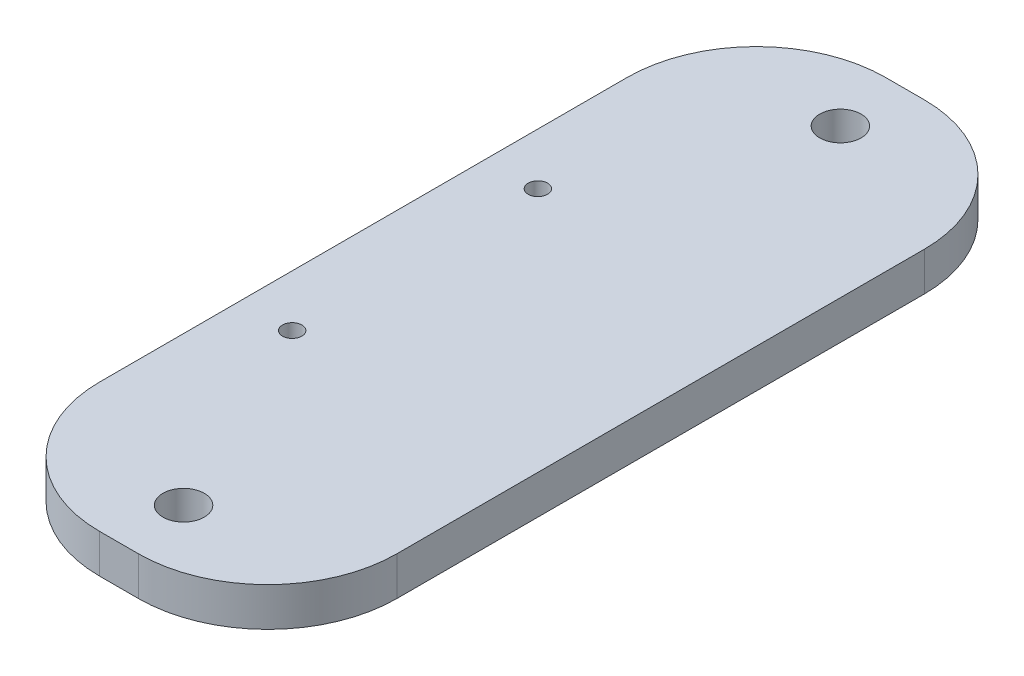
ISO-10303-21;
HEADER;
FILE_DESCRIPTION(('STEP AP214'),'2;1');
FILE_NAME('part.step','',(''),(''),'','','');
FILE_SCHEMA(('AUTOMOTIVE_DESIGN { 1 0 10303 214 1 1 1 1 }'));
ENDSEC;
DATA;
#1=APPLICATION_CONTEXT('core data for automotive mechanical design processes');
#2=APPLICATION_PROTOCOL_DEFINITION('international standard','automotive_design',2000,#1);
#3=PRODUCT_CONTEXT('',#1,'mechanical');
#4=PRODUCT('Part','Part','',(#3));
#5=PRODUCT_RELATED_PRODUCT_CATEGORY('part','',(#4));
#6=PRODUCT_DEFINITION_FORMATION('','',#4);
#7=PRODUCT_DEFINITION_CONTEXT('part definition',#1,'design');
#8=PRODUCT_DEFINITION('design','',#6,#7);
#9=PRODUCT_DEFINITION_SHAPE('','',#8);
#10=(LENGTH_UNIT() NAMED_UNIT(*) SI_UNIT(.MILLI.,.METRE.));
#11=(NAMED_UNIT(*) PLANE_ANGLE_UNIT() SI_UNIT($,.RADIAN.));
#12=(NAMED_UNIT(*) SI_UNIT($,.STERADIAN.) SOLID_ANGLE_UNIT());
#13=UNCERTAINTY_MEASURE_WITH_UNIT(LENGTH_MEASURE(1.E-05),#10,'distance_accuracy_value','');
#14=(GEOMETRIC_REPRESENTATION_CONTEXT(3) GLOBAL_UNCERTAINTY_ASSIGNED_CONTEXT((#13)) GLOBAL_UNIT_ASSIGNED_CONTEXT((#10,
#11,#12)) REPRESENTATION_CONTEXT('',''));
#15=CARTESIAN_POINT('',(0.,0.,0.));
#16=DIRECTION('',(0.,0.,1.));
#17=DIRECTION('',(1.,0.,0.));
#18=AXIS2_PLACEMENT_3D('',#15,#16,#17);
#19=CARTESIAN_POINT('',(0.,3.,0.));
#20=DIRECTION('',(0.,1.,0.));
#21=DIRECTION('',(0.,0.,1.));
#22=AXIS2_PLACEMENT_3D('',#19,#20,#21);
#23=PLANE('',#22);
#24=CARTESIAN_POINT('',(0.,3.,-25.4));
#25=DIRECTION('',(0.,1.,0.));
#26=DIRECTION('',(0.,0.,1.));
#27=AXIS2_PLACEMENT_3D('',#24,#25,#26);
#28=CIRCLE('',#27,1.6);
#29=CARTESIAN_POINT('',(0.,3.,-23.8));
#30=VERTEX_POINT('',#29);
#31=EDGE_CURVE('E200',#30,#30,#28,.T.);
#32=ORIENTED_EDGE('',*,*,#31,.F.);
#33=EDGE_LOOP('',(#32));
#34=FACE_BOUND('',#33,.T.);
#35=CARTESIAN_POINT('',(-7.5,3.,-9.5));
#36=DIRECTION('',(0.,1.,0.));
#37=DIRECTION('',(0.,0.,1.));
#38=AXIS2_PLACEMENT_3D('',#35,#36,#37);
#39=CIRCLE('',#38,0.750000000000002);
#40=CARTESIAN_POINT('',(-7.5,3.,-8.75));
#41=VERTEX_POINT('',#40);
#42=EDGE_CURVE('E137',#41,#41,#39,.T.);
#43=ORIENTED_EDGE('',*,*,#42,.F.);
#44=EDGE_LOOP('',(#43));
#45=FACE_BOUND('',#44,.T.);
#46=DIRECTION('',(1.,0.,0.));
#47=VECTOR('',#46,1.);
#48=CARTESIAN_POINT('',(-11.5,3.,30.4));
#49=LINE('',#48,#47);
#50=CARTESIAN_POINT('',(-1.5,3.,30.4));
#51=VERTEX_POINT('',#50);
#52=CARTESIAN_POINT('',(1.50000000000001,3.,30.4));
#53=VERTEX_POINT('',#52);
#54=EDGE_CURVE('E147',#51,#53,#49,.T.);
#55=ORIENTED_EDGE('',*,*,#54,.T.);
#56=CARTESIAN_POINT('',(1.50000000000001,3.,20.4));
#57=DIRECTION('',(0.,1.,0.));
#58=DIRECTION('',(0.,0.,1.));
#59=AXIS2_PLACEMENT_3D('',#56,#57,#58);
#60=CIRCLE('',#59,10.);
#61=CARTESIAN_POINT('',(11.5,3.,20.4));
#62=VERTEX_POINT('',#61);
#63=EDGE_CURVE('E167',#53,#62,#60,.T.);
#64=ORIENTED_EDGE('',*,*,#63,.T.);
#65=DIRECTION('',(0.,0.,-1.));
#66=VECTOR('',#65,1.);
#67=CARTESIAN_POINT('',(11.5,3.,-30.4));
#68=LINE('',#67,#66);
#69=CARTESIAN_POINT('',(11.5,3.,-20.4));
#70=VERTEX_POINT('',#69);
#71=EDGE_CURVE('E129',#62,#70,#68,.T.);
#72=ORIENTED_EDGE('',*,*,#71,.T.);
#73=CARTESIAN_POINT('',(1.5,3.,-20.4));
#74=DIRECTION('',(0.,1.,0.));
#75=DIRECTION('',(0.,0.,1.));
#76=AXIS2_PLACEMENT_3D('',#73,#74,#75);
#77=CIRCLE('',#76,10.);
#78=CARTESIAN_POINT('',(1.5,3.,-30.4));
#79=VERTEX_POINT('',#78);
#80=EDGE_CURVE('E162',#70,#79,#77,.T.);
#81=ORIENTED_EDGE('',*,*,#80,.T.);
#82=DIRECTION('',(-1.,0.,0.));
#83=VECTOR('',#82,1.);
#84=CARTESIAN_POINT('',(-11.5,3.,-30.4));
#85=LINE('',#84,#83);
#86=CARTESIAN_POINT('',(-1.5,3.,-30.4));
#87=VERTEX_POINT('',#86);
#88=EDGE_CURVE('E178',#79,#87,#85,.T.);
#89=ORIENTED_EDGE('',*,*,#88,.T.);
#90=CARTESIAN_POINT('',(-1.5,3.,-20.4));
#91=DIRECTION('',(0.,1.,0.));
#92=DIRECTION('',(0.,0.,1.));
#93=AXIS2_PLACEMENT_3D('',#90,#91,#92);
#94=CIRCLE('',#93,10.);
#95=CARTESIAN_POINT('',(-11.5,3.,-20.4));
#96=VERTEX_POINT('',#95);
#97=EDGE_CURVE('E65',#87,#96,#94,.T.);
#98=ORIENTED_EDGE('',*,*,#97,.T.);
#99=DIRECTION('',(0.,0.,1.));
#100=VECTOR('',#99,1.);
#101=CARTESIAN_POINT('',(-11.5,3.,-30.4));
#102=LINE('',#101,#100);
#103=CARTESIAN_POINT('',(-11.5,3.,20.4));
#104=VERTEX_POINT('',#103);
#105=EDGE_CURVE('E186',#96,#104,#102,.T.);
#106=ORIENTED_EDGE('',*,*,#105,.T.);
#107=CARTESIAN_POINT('',(-1.5,3.,20.4));
#108=DIRECTION('',(0.,1.,0.));
#109=DIRECTION('',(0.,0.,1.));
#110=AXIS2_PLACEMENT_3D('',#107,#108,#109);
#111=CIRCLE('',#110,10.);
#112=EDGE_CURVE('E165',#104,#51,#111,.T.);
#113=ORIENTED_EDGE('',*,*,#112,.T.);
#114=EDGE_LOOP('',(#55,#64,#72,#81,#89,#98,#106,#113));
#115=FACE_BOUND('',#114,.T.);
#116=CARTESIAN_POINT('',(-7.5,3.,9.5));
#117=DIRECTION('',(0.,1.,0.));
#118=DIRECTION('',(0.,0.,1.));
#119=AXIS2_PLACEMENT_3D('',#116,#117,#118);
#120=CIRCLE('',#119,0.750000000000002);
#121=CARTESIAN_POINT('',(-7.5,3.,10.25));
#122=VERTEX_POINT('',#121);
#123=EDGE_CURVE('E195',#122,#122,#120,.T.);
#124=ORIENTED_EDGE('',*,*,#123,.F.);
#125=EDGE_LOOP('',(#124));
#126=FACE_BOUND('',#125,.T.);
#127=CARTESIAN_POINT('',(0.,3.,25.4));
#128=DIRECTION('',(0.,1.,0.));
#129=DIRECTION('',(0.,0.,1.));
#130=AXIS2_PLACEMENT_3D('',#127,#128,#129);
#131=CIRCLE('',#130,1.6);
#132=CARTESIAN_POINT('',(0.,3.,27.));
#133=VERTEX_POINT('',#132);
#134=EDGE_CURVE('E206',#133,#133,#131,.T.);
#135=ORIENTED_EDGE('',*,*,#134,.F.);
#136=EDGE_LOOP('',(#135));
#137=FACE_BOUND('',#136,.T.);
#138=ADVANCED_FACE('F43',(#34,#45,#115,#126,#137),#23,.T.);
#139=CARTESIAN_POINT('',(0.,0.,0.));
#140=DIRECTION('',(0.,1.,0.));
#141=DIRECTION('',(0.,0.,1.));
#142=AXIS2_PLACEMENT_3D('',#139,#140,#141);
#143=PLANE('',#142);
#144=DIRECTION('',(0.,0.,-1.));
#145=VECTOR('',#144,1.);
#146=CARTESIAN_POINT('',(11.5,0.,-30.4));
#147=LINE('',#146,#145);
#148=CARTESIAN_POINT('',(11.5,0.,20.4));
#149=VERTEX_POINT('',#148);
#150=CARTESIAN_POINT('',(11.5,0.,-20.4));
#151=VERTEX_POINT('',#150);
#152=EDGE_CURVE('E126',#149,#151,#147,.T.);
#153=ORIENTED_EDGE('',*,*,#152,.F.);
#154=CARTESIAN_POINT('',(1.50000000000001,0.,20.4));
#155=DIRECTION('',(0.,1.,0.));
#156=DIRECTION('',(0.,0.,1.));
#157=AXIS2_PLACEMENT_3D('',#154,#155,#156);
#158=CIRCLE('',#157,10.);
#159=CARTESIAN_POINT('',(1.50000000000001,0.,30.4));
#160=VERTEX_POINT('',#159);
#161=EDGE_CURVE('E109',#149,#160,#158,.F.);
#162=ORIENTED_EDGE('',*,*,#161,.T.);
#163=DIRECTION('',(1.,0.,0.));
#164=VECTOR('',#163,1.);
#165=CARTESIAN_POINT('',(-11.5,0.,30.4));
#166=LINE('',#165,#164);
#167=CARTESIAN_POINT('',(-1.5,0.,30.4));
#168=VERTEX_POINT('',#167);
#169=EDGE_CURVE('E152',#168,#160,#166,.T.);
#170=ORIENTED_EDGE('',*,*,#169,.F.);
#171=CARTESIAN_POINT('',(-1.5,0.,20.4));
#172=DIRECTION('',(0.,1.,0.));
#173=DIRECTION('',(0.,0.,1.));
#174=AXIS2_PLACEMENT_3D('',#171,#172,#173);
#175=CIRCLE('',#174,10.);
#176=CARTESIAN_POINT('',(-11.5,0.,20.4));
#177=VERTEX_POINT('',#176);
#178=EDGE_CURVE('E120',#168,#177,#175,.F.);
#179=ORIENTED_EDGE('',*,*,#178,.T.);
#180=DIRECTION('',(0.,0.,1.));
#181=VECTOR('',#180,1.);
#182=CARTESIAN_POINT('',(-11.5,0.,-30.4));
#183=LINE('',#182,#181);
#184=CARTESIAN_POINT('',(-11.5,0.,-20.4));
#185=VERTEX_POINT('',#184);
#186=EDGE_CURVE('E140',#185,#177,#183,.T.);
#187=ORIENTED_EDGE('',*,*,#186,.F.);
#188=CARTESIAN_POINT('',(-1.5,0.,-20.4));
#189=DIRECTION('',(0.,1.,0.));
#190=DIRECTION('',(0.,0.,1.));
#191=AXIS2_PLACEMENT_3D('',#188,#189,#190);
#192=CIRCLE('',#191,10.);
#193=CARTESIAN_POINT('',(-1.5,0.,-30.4));
#194=VERTEX_POINT('',#193);
#195=EDGE_CURVE('E156',#185,#194,#192,.F.);
#196=ORIENTED_EDGE('',*,*,#195,.T.);
#197=DIRECTION('',(-1.,0.,0.));
#198=VECTOR('',#197,1.);
#199=CARTESIAN_POINT('',(-11.5,0.,-30.4));
#200=LINE('',#199,#198);
#201=CARTESIAN_POINT('',(1.5,0.,-30.4));
#202=VERTEX_POINT('',#201);
#203=EDGE_CURVE('E136',#202,#194,#200,.T.);
#204=ORIENTED_EDGE('',*,*,#203,.F.);
#205=CARTESIAN_POINT('',(1.5,0.,-20.4));
#206=DIRECTION('',(0.,1.,0.));
#207=DIRECTION('',(0.,0.,1.));
#208=AXIS2_PLACEMENT_3D('',#205,#206,#207);
#209=CIRCLE('',#208,10.);
#210=EDGE_CURVE('E130',#202,#151,#209,.F.);
#211=ORIENTED_EDGE('',*,*,#210,.T.);
#212=EDGE_LOOP('',(#153,#162,#170,#179,#187,#196,#204,#211));
#213=FACE_BOUND('',#212,.T.);
#214=CARTESIAN_POINT('',(-7.5,0.,-9.5));
#215=DIRECTION('',(0.,1.,0.));
#216=DIRECTION('',(0.,0.,1.));
#217=AXIS2_PLACEMENT_3D('',#214,#215,#216);
#218=CIRCLE('',#217,0.750000000000002);
#219=CARTESIAN_POINT('',(-7.5,0.,-8.75));
#220=VERTEX_POINT('',#219);
#221=EDGE_CURVE('E144',#220,#220,#218,.T.);
#222=ORIENTED_EDGE('',*,*,#221,.T.);
#223=EDGE_LOOP('',(#222));
#224=FACE_BOUND('',#223,.T.);
#225=CARTESIAN_POINT('',(-7.5,0.,9.5));
#226=DIRECTION('',(0.,1.,0.));
#227=DIRECTION('',(0.,0.,1.));
#228=AXIS2_PLACEMENT_3D('',#225,#226,#227);
#229=CIRCLE('',#228,0.750000000000002);
#230=CARTESIAN_POINT('',(-7.5,0.,10.25));
#231=VERTEX_POINT('',#230);
#232=EDGE_CURVE('E197',#231,#231,#229,.T.);
#233=ORIENTED_EDGE('',*,*,#232,.T.);
#234=EDGE_LOOP('',(#233));
#235=FACE_BOUND('',#234,.T.);
#236=CARTESIAN_POINT('',(0.,0.,-25.4));
#237=DIRECTION('',(0.,1.,0.));
#238=DIRECTION('',(0.,0.,1.));
#239=AXIS2_PLACEMENT_3D('',#236,#237,#238);
#240=CIRCLE('',#239,1.6);
#241=CARTESIAN_POINT('',(0.,0.,-23.8));
#242=VERTEX_POINT('',#241);
#243=EDGE_CURVE('E203',#242,#242,#240,.T.);
#244=ORIENTED_EDGE('',*,*,#243,.T.);
#245=EDGE_LOOP('',(#244));
#246=FACE_BOUND('',#245,.T.);
#247=CARTESIAN_POINT('',(0.,0.,25.4));
#248=DIRECTION('',(0.,1.,0.));
#249=DIRECTION('',(0.,0.,1.));
#250=AXIS2_PLACEMENT_3D('',#247,#248,#249);
#251=CIRCLE('',#250,1.6);
#252=CARTESIAN_POINT('',(0.,0.,27.));
#253=VERTEX_POINT('',#252);
#254=EDGE_CURVE('E209',#253,#253,#251,.T.);
#255=ORIENTED_EDGE('',*,*,#254,.T.);
#256=EDGE_LOOP('',(#255));
#257=FACE_BOUND('',#256,.T.);
#258=ADVANCED_FACE('F133',(#213,#224,#235,#246,#257),#143,.F.);
#259=CARTESIAN_POINT('',(11.5,3.,-30.4));
#260=DIRECTION('',(-1.,0.,0.));
#261=DIRECTION('',(0.,0.,1.));
#262=AXIS2_PLACEMENT_3D('',#259,#260,#261);
#263=PLANE('',#262);
#264=ORIENTED_EDGE('',*,*,#71,.F.);
#265=DIRECTION('',(0.,-1.,0.));
#266=VECTOR('',#265,1.);
#267=CARTESIAN_POINT('',(11.5,3.,20.4));
#268=LINE('',#267,#266);
#269=EDGE_CURVE('E113',#62,#149,#268,.T.);
#270=ORIENTED_EDGE('',*,*,#269,.T.);
#271=ORIENTED_EDGE('',*,*,#152,.T.);
#272=DIRECTION('',(0.,-1.,0.));
#273=VECTOR('',#272,1.);
#274=CARTESIAN_POINT('',(11.5,3.,-20.4));
#275=LINE('',#274,#273);
#276=EDGE_CURVE('E131',#151,#70,#275,.F.);
#277=ORIENTED_EDGE('',*,*,#276,.T.);
#278=EDGE_LOOP('',(#264,#270,#271,#277));
#279=FACE_BOUND('',#278,.T.);
#280=ADVANCED_FACE('F125',(#279),#263,.F.);
#281=CARTESIAN_POINT('',(-11.5,3.,-30.4));
#282=DIRECTION('',(0.,0.,1.));
#283=DIRECTION('',(1.,0.,0.));
#284=AXIS2_PLACEMENT_3D('',#281,#282,#283);
#285=PLANE('',#284);
#286=ORIENTED_EDGE('',*,*,#203,.T.);
#287=DIRECTION('',(0.,-1.,0.));
#288=VECTOR('',#287,1.);
#289=CARTESIAN_POINT('',(-1.5,3.,-30.4));
#290=LINE('',#289,#288);
#291=EDGE_CURVE('E11',#194,#87,#290,.F.);
#292=ORIENTED_EDGE('',*,*,#291,.T.);
#293=ORIENTED_EDGE('',*,*,#88,.F.);
#294=DIRECTION('',(0.,-1.,0.));
#295=VECTOR('',#294,1.);
#296=CARTESIAN_POINT('',(1.5,3.,-30.4));
#297=LINE('',#296,#295);
#298=EDGE_CURVE('E51',#79,#202,#297,.T.);
#299=ORIENTED_EDGE('',*,*,#298,.T.);
#300=EDGE_LOOP('',(#286,#292,#293,#299));
#301=FACE_BOUND('',#300,.T.);
#302=ADVANCED_FACE('F176',(#301),#285,.F.);
#303=CARTESIAN_POINT('',(-11.5,3.,-30.4));
#304=DIRECTION('',(1.,0.,0.));
#305=DIRECTION('',(0.,0.,-1.));
#306=AXIS2_PLACEMENT_3D('',#303,#304,#305);
#307=PLANE('',#306);
#308=ORIENTED_EDGE('',*,*,#186,.T.);
#309=DIRECTION('',(0.,-1.,0.));
#310=VECTOR('',#309,1.);
#311=CARTESIAN_POINT('',(-11.5,3.,20.4));
#312=LINE('',#311,#310);
#313=EDGE_CURVE('E58',#177,#104,#312,.F.);
#314=ORIENTED_EDGE('',*,*,#313,.T.);
#315=ORIENTED_EDGE('',*,*,#105,.F.);
#316=DIRECTION('',(0.,-1.,0.));
#317=VECTOR('',#316,1.);
#318=CARTESIAN_POINT('',(-11.5,3.,-20.4));
#319=LINE('',#318,#317);
#320=EDGE_CURVE('E169',#96,#185,#319,.T.);
#321=ORIENTED_EDGE('',*,*,#320,.T.);
#322=EDGE_LOOP('',(#308,#314,#315,#321));
#323=FACE_BOUND('',#322,.T.);
#324=ADVANCED_FACE('F185',(#323),#307,.F.);
#325=CARTESIAN_POINT('',(-11.5,3.,30.4));
#326=DIRECTION('',(0.,0.,-1.));
#327=DIRECTION('',(-1.,0.,0.));
#328=AXIS2_PLACEMENT_3D('',#325,#326,#327);
#329=PLANE('',#328);
#330=ORIENTED_EDGE('',*,*,#169,.T.);
#331=DIRECTION('',(0.,-1.,0.));
#332=VECTOR('',#331,1.);
#333=CARTESIAN_POINT('',(1.50000000000001,3.,30.4));
#334=LINE('',#333,#332);
#335=EDGE_CURVE('E114',#160,#53,#334,.F.);
#336=ORIENTED_EDGE('',*,*,#335,.T.);
#337=ORIENTED_EDGE('',*,*,#54,.F.);
#338=DIRECTION('',(0.,-1.,0.));
#339=VECTOR('',#338,1.);
#340=CARTESIAN_POINT('',(-1.5,3.,30.4));
#341=LINE('',#340,#339);
#342=EDGE_CURVE('E119',#51,#168,#341,.T.);
#343=ORIENTED_EDGE('',*,*,#342,.T.);
#344=EDGE_LOOP('',(#330,#336,#337,#343));
#345=FACE_BOUND('',#344,.T.);
#346=ADVANCED_FACE('F230',(#345),#329,.F.);
#347=CARTESIAN_POINT('',(-7.5,3.,-9.5));
#348=DIRECTION('',(0.,-1.,0.));
#349=DIRECTION('',(0.,0.,-1.));
#350=AXIS2_PLACEMENT_3D('',#347,#348,#349);
#351=CYLINDRICAL_SURFACE('',#350,0.750000000000002);
#352=ORIENTED_EDGE('',*,*,#42,.T.);
#353=EDGE_LOOP('',(#352));
#354=FACE_BOUND('',#353,.T.);
#355=ORIENTED_EDGE('',*,*,#221,.F.);
#356=EDGE_LOOP('',(#355));
#357=FACE_BOUND('',#356,.T.);
#358=ADVANCED_FACE('F227',(#354,#357),#351,.F.);
#359=CARTESIAN_POINT('',(-7.5,3.,9.5));
#360=DIRECTION('',(0.,-1.,0.));
#361=DIRECTION('',(0.,0.,-1.));
#362=AXIS2_PLACEMENT_3D('',#359,#360,#361);
#363=CYLINDRICAL_SURFACE('',#362,0.750000000000002);
#364=ORIENTED_EDGE('',*,*,#123,.T.);
#365=EDGE_LOOP('',(#364));
#366=FACE_BOUND('',#365,.T.);
#367=ORIENTED_EDGE('',*,*,#232,.F.);
#368=EDGE_LOOP('',(#367));
#369=FACE_BOUND('',#368,.T.);
#370=ADVANCED_FACE('F256',(#366,#369),#363,.F.);
#371=CARTESIAN_POINT('',(0.,3.,-25.4));
#372=DIRECTION('',(0.,-1.,0.));
#373=DIRECTION('',(0.,0.,-1.));
#374=AXIS2_PLACEMENT_3D('',#371,#372,#373);
#375=CYLINDRICAL_SURFACE('',#374,1.6);
#376=ORIENTED_EDGE('',*,*,#31,.T.);
#377=EDGE_LOOP('',(#376));
#378=FACE_BOUND('',#377,.T.);
#379=ORIENTED_EDGE('',*,*,#243,.F.);
#380=EDGE_LOOP('',(#379));
#381=FACE_BOUND('',#380,.T.);
#382=ADVANCED_FACE('F259',(#378,#381),#375,.F.);
#383=CARTESIAN_POINT('',(0.,3.,25.4));
#384=DIRECTION('',(0.,-1.,0.));
#385=DIRECTION('',(0.,0.,-1.));
#386=AXIS2_PLACEMENT_3D('',#383,#384,#385);
#387=CYLINDRICAL_SURFACE('',#386,1.6);
#388=ORIENTED_EDGE('',*,*,#134,.T.);
#389=EDGE_LOOP('',(#388));
#390=FACE_BOUND('',#389,.T.);
#391=ORIENTED_EDGE('',*,*,#254,.F.);
#392=EDGE_LOOP('',(#391));
#393=FACE_BOUND('',#392,.T.);
#394=ADVANCED_FACE('F215',(#390,#393),#387,.F.);
#395=CARTESIAN_POINT('',(1.50000000000001,3.,20.4));
#396=DIRECTION('',(0.,-1.,0.));
#397=DIRECTION('',(0.,0.,-1.));
#398=AXIS2_PLACEMENT_3D('',#395,#396,#397);
#399=CYLINDRICAL_SURFACE('',#398,10.);
#400=ORIENTED_EDGE('',*,*,#63,.F.);
#401=ORIENTED_EDGE('',*,*,#335,.F.);
#402=ORIENTED_EDGE('',*,*,#161,.F.);
#403=ORIENTED_EDGE('',*,*,#269,.F.);
#404=EDGE_LOOP('',(#400,#401,#402,#403));
#405=FACE_BOUND('',#404,.T.);
#406=ADVANCED_FACE('F112',(#405),#399,.T.);
#407=CARTESIAN_POINT('',(-1.5,3.,20.4));
#408=DIRECTION('',(0.,-1.,0.));
#409=DIRECTION('',(0.,0.,-1.));
#410=AXIS2_PLACEMENT_3D('',#407,#408,#409);
#411=CYLINDRICAL_SURFACE('',#410,10.);
#412=ORIENTED_EDGE('',*,*,#112,.F.);
#413=ORIENTED_EDGE('',*,*,#313,.F.);
#414=ORIENTED_EDGE('',*,*,#178,.F.);
#415=ORIENTED_EDGE('',*,*,#342,.F.);
#416=EDGE_LOOP('',(#412,#413,#414,#415));
#417=FACE_BOUND('',#416,.T.);
#418=ADVANCED_FACE('F242',(#417),#411,.T.);
#419=CARTESIAN_POINT('',(-1.5,3.,-20.4));
#420=DIRECTION('',(0.,-1.,0.));
#421=DIRECTION('',(0.,0.,-1.));
#422=AXIS2_PLACEMENT_3D('',#419,#420,#421);
#423=CYLINDRICAL_SURFACE('',#422,10.);
#424=ORIENTED_EDGE('',*,*,#97,.F.);
#425=ORIENTED_EDGE('',*,*,#291,.F.);
#426=ORIENTED_EDGE('',*,*,#195,.F.);
#427=ORIENTED_EDGE('',*,*,#320,.F.);
#428=EDGE_LOOP('',(#424,#425,#426,#427));
#429=FACE_BOUND('',#428,.T.);
#430=ADVANCED_FACE('F184',(#429),#423,.T.);
#431=CARTESIAN_POINT('',(1.5,3.,-20.4));
#432=DIRECTION('',(0.,-1.,0.));
#433=DIRECTION('',(0.,0.,-1.));
#434=AXIS2_PLACEMENT_3D('',#431,#432,#433);
#435=CYLINDRICAL_SURFACE('',#434,10.);
#436=ORIENTED_EDGE('',*,*,#80,.F.);
#437=ORIENTED_EDGE('',*,*,#276,.F.);
#438=ORIENTED_EDGE('',*,*,#210,.F.);
#439=ORIENTED_EDGE('',*,*,#298,.F.);
#440=EDGE_LOOP('',(#436,#437,#438,#439));
#441=FACE_BOUND('',#440,.T.);
#442=ADVANCED_FACE('F45',(#441),#435,.T.);
#443=CLOSED_SHELL('',(#138,#258,#280,#302,#324,#346,#358,#370,#382,#394,#406,#418,#430,#442));
#444=MANIFOLD_SOLID_BREP('B2',#443);
#445=ADVANCED_BREP_SHAPE_REPRESENTATION('',(#18,#444),#14);
#446=SHAPE_DEFINITION_REPRESENTATION(#9,#445);
ENDSEC;
END-ISO-10303-21;
